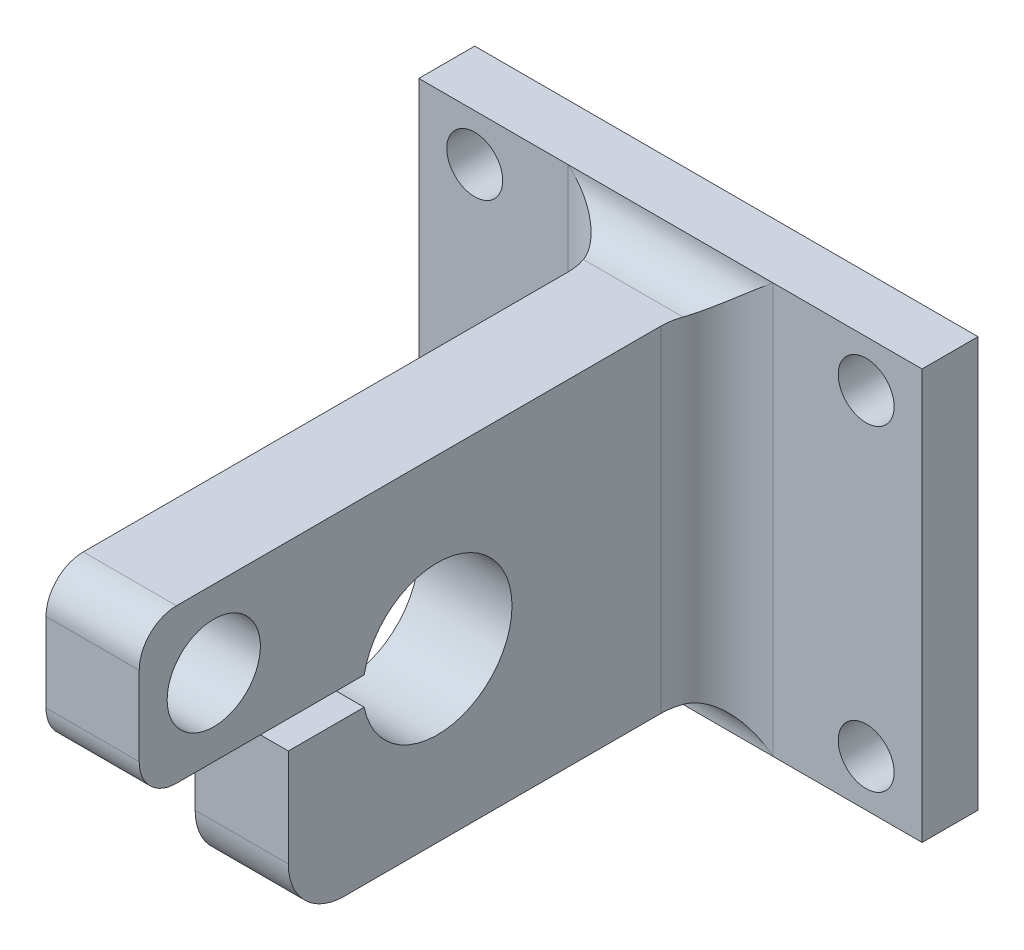
ISO-10303-21;
HEADER;
FILE_DESCRIPTION(('STEP AP214'),'2;1');
FILE_NAME('part.step','',(''),(''),'','','');
FILE_SCHEMA(('AUTOMOTIVE_DESIGN { 1 0 10303 214 1 1 1 1 }'));
ENDSEC;
DATA;
#1=APPLICATION_CONTEXT('core data for automotive mechanical design processes');
#2=APPLICATION_PROTOCOL_DEFINITION('international standard','automotive_design',2000,#1);
#3=PRODUCT_CONTEXT('',#1,'mechanical');
#4=PRODUCT('Part','Part','',(#3));
#5=PRODUCT_RELATED_PRODUCT_CATEGORY('part','',(#4));
#6=PRODUCT_DEFINITION_FORMATION('','',#4);
#7=PRODUCT_DEFINITION_CONTEXT('part definition',#1,'design');
#8=PRODUCT_DEFINITION('design','',#6,#7);
#9=PRODUCT_DEFINITION_SHAPE('','',#8);
#10=(LENGTH_UNIT() NAMED_UNIT(*) SI_UNIT(.MILLI.,.METRE.));
#11=(NAMED_UNIT(*) PLANE_ANGLE_UNIT() SI_UNIT($,.RADIAN.));
#12=(NAMED_UNIT(*) SI_UNIT($,.STERADIAN.) SOLID_ANGLE_UNIT());
#13=UNCERTAINTY_MEASURE_WITH_UNIT(LENGTH_MEASURE(1.E-05),#10,'distance_accuracy_value','');
#14=(GEOMETRIC_REPRESENTATION_CONTEXT(3) GLOBAL_UNCERTAINTY_ASSIGNED_CONTEXT((#13)) GLOBAL_UNIT_ASSIGNED_CONTEXT((#10,
#11,#12)) REPRESENTATION_CONTEXT('',''));
#15=CARTESIAN_POINT('',(0.,0.,0.));
#16=DIRECTION('',(0.,0.,1.));
#17=DIRECTION('',(1.,0.,0.));
#18=AXIS2_PLACEMENT_3D('',#15,#16,#17);
#19=CARTESIAN_POINT('',(0.,0.,3.));
#20=DIRECTION('',(0.,0.,-1.));
#21=DIRECTION('',(-1.,0.,0.));
#22=AXIS2_PLACEMENT_3D('',#19,#20,#21);
#23=PLANE('',#22);
#24=CARTESIAN_POINT('',(-10.5,8.5,3.));
#25=DIRECTION('',(0.,0.,1.));
#26=DIRECTION('',(1.,0.,0.));
#27=AXIS2_PLACEMENT_3D('',#24,#25,#26);
#28=CIRCLE('',#27,1.5);
#29=CARTESIAN_POINT('',(-9.,8.5,3.));
#30=VERTEX_POINT('',#29);
#31=EDGE_CURVE('E238',#30,#30,#28,.T.);
#32=ORIENTED_EDGE('',*,*,#31,.F.);
#33=EDGE_LOOP('',(#32));
#34=FACE_BOUND('',#33,.T.);
#35=CARTESIAN_POINT('',(-10.5,-8.5,3.));
#36=DIRECTION('',(0.,0.,1.));
#37=DIRECTION('',(1.,0.,0.));
#38=AXIS2_PLACEMENT_3D('',#35,#36,#37);
#39=CIRCLE('',#38,1.5);
#40=CARTESIAN_POINT('',(-9.,-8.5,3.));
#41=VERTEX_POINT('',#40);
#42=EDGE_CURVE('E226',#41,#41,#39,.T.);
#43=ORIENTED_EDGE('',*,*,#42,.F.);
#44=EDGE_LOOP('',(#43));
#45=FACE_BOUND('',#44,.T.);
#46=DIRECTION('',(0.,-1.,0.));
#47=VECTOR('',#46,1.);
#48=CARTESIAN_POINT('',(-5.5,9.,3.));
#49=LINE('',#48,#47);
#50=CARTESIAN_POINT('',(-5.5,-11.,3.));
#51=VERTEX_POINT('',#50);
#52=CARTESIAN_POINT('',(-5.5,11.,3.));
#53=VERTEX_POINT('',#52);
#54=EDGE_CURVE('E284',#51,#53,#49,.F.);
#55=ORIENTED_EDGE('',*,*,#54,.T.);
#56=DIRECTION('',(-1.,0.,0.));
#57=VECTOR('',#56,1.);
#58=CARTESIAN_POINT('',(-13.5,11.,3.));
#59=LINE('',#58,#57);
#60=CARTESIAN_POINT('',(-13.5,11.,3.));
#61=VERTEX_POINT('',#60);
#62=EDGE_CURVE('E247',#53,#61,#59,.T.);
#63=ORIENTED_EDGE('',*,*,#62,.T.);
#64=DIRECTION('',(0.,-1.,0.));
#65=VECTOR('',#64,1.);
#66=CARTESIAN_POINT('',(-13.5,-11.,3.));
#67=LINE('',#66,#65);
#68=CARTESIAN_POINT('',(-13.5,-11.,3.));
#69=VERTEX_POINT('',#68);
#70=EDGE_CURVE('E252',#61,#69,#67,.T.);
#71=ORIENTED_EDGE('',*,*,#70,.T.);
#72=DIRECTION('',(1.,0.,0.));
#73=VECTOR('',#72,1.);
#74=CARTESIAN_POINT('',(-13.5,-11.,3.));
#75=LINE('',#74,#73);
#76=EDGE_CURVE('E256',#69,#51,#75,.T.);
#77=ORIENTED_EDGE('',*,*,#76,.T.);
#78=EDGE_LOOP('',(#55,#63,#71,#77));
#79=FACE_BOUND('',#78,.T.);
#80=ADVANCED_FACE('F41',(#34,#45,#79),#23,.F.);
#81=CARTESIAN_POINT('',(10.5,-8.5,3.));
#82=DIRECTION('',(0.,0.,1.));
#83=DIRECTION('',(1.,0.,0.));
#84=AXIS2_PLACEMENT_3D('',#81,#82,#83);
#85=CIRCLE('',#84,1.5);
#86=CARTESIAN_POINT('',(12.,-8.5,3.));
#87=VERTEX_POINT('',#86);
#88=EDGE_CURVE('E220',#87,#87,#85,.T.);
#89=ORIENTED_EDGE('',*,*,#88,.F.);
#90=EDGE_LOOP('',(#89));
#91=FACE_BOUND('',#90,.T.);
#92=CARTESIAN_POINT('',(10.5,8.5,3.));
#93=DIRECTION('',(0.,0.,1.));
#94=DIRECTION('',(1.,0.,0.));
#95=AXIS2_PLACEMENT_3D('',#92,#93,#94);
#96=CIRCLE('',#95,1.5);
#97=CARTESIAN_POINT('',(12.,8.5,3.));
#98=VERTEX_POINT('',#97);
#99=EDGE_CURVE('E232',#98,#98,#96,.T.);
#100=ORIENTED_EDGE('',*,*,#99,.F.);
#101=EDGE_LOOP('',(#100));
#102=FACE_BOUND('',#101,.T.);
#103=CARTESIAN_POINT('',(13.5,11.,3.));
#104=VERTEX_POINT('',#103);
#105=CARTESIAN_POINT('',(5.5,11.,3.));
#106=VERTEX_POINT('',#105);
#107=EDGE_CURVE('E249',#104,#106,#59,.T.);
#108=ORIENTED_EDGE('',*,*,#107,.T.);
#109=DIRECTION('',(0.,1.,0.));
#110=VECTOR('',#109,1.);
#111=CARTESIAN_POINT('',(5.5,-9.,3.));
#112=LINE('',#111,#110);
#113=CARTESIAN_POINT('',(5.5,-11.,3.));
#114=VERTEX_POINT('',#113);
#115=EDGE_CURVE('E282',#106,#114,#112,.F.);
#116=ORIENTED_EDGE('',*,*,#115,.T.);
#117=CARTESIAN_POINT('',(13.5,-11.,3.));
#118=VERTEX_POINT('',#117);
#119=EDGE_CURVE('E255',#114,#118,#75,.T.);
#120=ORIENTED_EDGE('',*,*,#119,.T.);
#121=DIRECTION('',(0.,1.,0.));
#122=VECTOR('',#121,1.);
#123=CARTESIAN_POINT('',(13.5,-11.,3.));
#124=LINE('',#123,#122);
#125=EDGE_CURVE('E244',#118,#104,#124,.T.);
#126=ORIENTED_EDGE('',*,*,#125,.T.);
#127=EDGE_LOOP('',(#108,#116,#120,#126));
#128=FACE_BOUND('',#127,.T.);
#129=ADVANCED_FACE('F443',(#91,#102,#128),#23,.F.);
#130=CARTESIAN_POINT('',(0.,0.,0.));
#131=DIRECTION('',(0.,0.,-1.));
#132=DIRECTION('',(-1.,0.,0.));
#133=AXIS2_PLACEMENT_3D('',#130,#131,#132);
#134=PLANE('',#133);
#135=CARTESIAN_POINT('',(-10.5,-8.5,0.));
#136=DIRECTION('',(0.,0.,1.));
#137=DIRECTION('',(1.,0.,0.));
#138=AXIS2_PLACEMENT_3D('',#135,#136,#137);
#139=CIRCLE('',#138,1.5);
#140=CARTESIAN_POINT('',(-9.,-8.5,0.));
#141=VERTEX_POINT('',#140);
#142=EDGE_CURVE('E223',#141,#141,#139,.T.);
#143=ORIENTED_EDGE('',*,*,#142,.T.);
#144=EDGE_LOOP('',(#143));
#145=FACE_BOUND('',#144,.T.);
#146=CARTESIAN_POINT('',(-10.5,8.5,0.));
#147=DIRECTION('',(0.,0.,1.));
#148=DIRECTION('',(1.,0.,0.));
#149=AXIS2_PLACEMENT_3D('',#146,#147,#148);
#150=CIRCLE('',#149,1.5);
#151=CARTESIAN_POINT('',(-9.,8.5,0.));
#152=VERTEX_POINT('',#151);
#153=EDGE_CURVE('E235',#152,#152,#150,.T.);
#154=ORIENTED_EDGE('',*,*,#153,.T.);
#155=EDGE_LOOP('',(#154));
#156=FACE_BOUND('',#155,.T.);
#157=DIRECTION('',(0.,1.,0.));
#158=VECTOR('',#157,1.);
#159=CARTESIAN_POINT('',(13.5,-11.,0.));
#160=LINE('',#159,#158);
#161=CARTESIAN_POINT('',(13.5,-11.,0.));
#162=VERTEX_POINT('',#161);
#163=CARTESIAN_POINT('',(13.5,11.,0.));
#164=VERTEX_POINT('',#163);
#165=EDGE_CURVE('E241',#162,#164,#160,.T.);
#166=ORIENTED_EDGE('',*,*,#165,.F.);
#167=DIRECTION('',(1.,0.,0.));
#168=VECTOR('',#167,1.);
#169=CARTESIAN_POINT('',(-13.5,-11.,0.));
#170=LINE('',#169,#168);
#171=CARTESIAN_POINT('',(-13.5,-11.,0.));
#172=VERTEX_POINT('',#171);
#173=EDGE_CURVE('E248',#172,#162,#170,.T.);
#174=ORIENTED_EDGE('',*,*,#173,.F.);
#175=DIRECTION('',(0.,-1.,0.));
#176=VECTOR('',#175,1.);
#177=CARTESIAN_POINT('',(-13.5,-11.,0.));
#178=LINE('',#177,#176);
#179=CARTESIAN_POINT('',(-13.5,11.,0.));
#180=VERTEX_POINT('',#179);
#181=EDGE_CURVE('E265',#180,#172,#178,.T.);
#182=ORIENTED_EDGE('',*,*,#181,.F.);
#183=DIRECTION('',(-1.,0.,0.));
#184=VECTOR('',#183,1.);
#185=CARTESIAN_POINT('',(-13.5,11.,0.));
#186=LINE('',#185,#184);
#187=EDGE_CURVE('E263',#164,#180,#186,.T.);
#188=ORIENTED_EDGE('',*,*,#187,.F.);
#189=EDGE_LOOP('',(#166,#174,#182,#188));
#190=FACE_BOUND('',#189,.T.);
#191=CARTESIAN_POINT('',(10.5,8.5,0.));
#192=DIRECTION('',(0.,0.,1.));
#193=DIRECTION('',(1.,0.,0.));
#194=AXIS2_PLACEMENT_3D('',#191,#192,#193);
#195=CIRCLE('',#194,1.5);
#196=CARTESIAN_POINT('',(12.,8.5,0.));
#197=VERTEX_POINT('',#196);
#198=EDGE_CURVE('E229',#197,#197,#195,.T.);
#199=ORIENTED_EDGE('',*,*,#198,.T.);
#200=EDGE_LOOP('',(#199));
#201=FACE_BOUND('',#200,.T.);
#202=CARTESIAN_POINT('',(10.5,-8.5,0.));
#203=DIRECTION('',(0.,0.,1.));
#204=DIRECTION('',(1.,0.,0.));
#205=AXIS2_PLACEMENT_3D('',#202,#203,#204);
#206=CIRCLE('',#205,1.5);
#207=CARTESIAN_POINT('',(12.,-8.5,0.));
#208=VERTEX_POINT('',#207);
#209=EDGE_CURVE('E219',#208,#208,#206,.T.);
#210=ORIENTED_EDGE('',*,*,#209,.T.);
#211=EDGE_LOOP('',(#210));
#212=FACE_BOUND('',#211,.T.);
#213=ADVANCED_FACE('F453',(#145,#156,#190,#201,#212),#134,.T.);
#214=CARTESIAN_POINT('',(13.5,-11.,3.));
#215=DIRECTION('',(-1.,0.,0.));
#216=DIRECTION('',(0.,0.,1.));
#217=AXIS2_PLACEMENT_3D('',#214,#215,#216);
#218=PLANE('',#217);
#219=ORIENTED_EDGE('',*,*,#165,.T.);
#220=DIRECTION('',(0.,0.,-1.));
#221=VECTOR('',#220,1.);
#222=CARTESIAN_POINT('',(13.5,11.,3.));
#223=LINE('',#222,#221);
#224=EDGE_CURVE('E185',#104,#164,#223,.T.);
#225=ORIENTED_EDGE('',*,*,#224,.F.);
#226=ORIENTED_EDGE('',*,*,#125,.F.);
#227=DIRECTION('',(0.,0.,-1.));
#228=VECTOR('',#227,1.);
#229=CARTESIAN_POINT('',(13.5,-11.,3.));
#230=LINE('',#229,#228);
#231=EDGE_CURVE('E259',#118,#162,#230,.T.);
#232=ORIENTED_EDGE('',*,*,#231,.T.);
#233=EDGE_LOOP('',(#219,#225,#226,#232));
#234=FACE_BOUND('',#233,.T.);
#235=ADVANCED_FACE('F448',(#234),#218,.F.);
#236=CARTESIAN_POINT('',(-13.5,11.,3.));
#237=DIRECTION('',(0.,-1.,0.));
#238=DIRECTION('',(0.,0.,-1.));
#239=AXIS2_PLACEMENT_3D('',#236,#237,#238);
#240=PLANE('',#239);
#241=ORIENTED_EDGE('',*,*,#187,.T.);
#242=DIRECTION('',(0.,0.,-1.));
#243=VECTOR('',#242,1.);
#244=CARTESIAN_POINT('',(-13.5,11.,3.));
#245=LINE('',#244,#243);
#246=EDGE_CURVE('E273',#61,#180,#245,.T.);
#247=ORIENTED_EDGE('',*,*,#246,.F.);
#248=ORIENTED_EDGE('',*,*,#62,.F.);
#249=EDGE_CURVE('E253',#106,#53,#59,.T.);
#250=ORIENTED_EDGE('',*,*,#249,.F.);
#251=ORIENTED_EDGE('',*,*,#107,.F.);
#252=ORIENTED_EDGE('',*,*,#224,.T.);
#253=EDGE_LOOP('',(#241,#247,#248,#250,#251,#252));
#254=FACE_BOUND('',#253,.T.);
#255=ADVANCED_FACE('F433',(#254),#240,.F.);
#256=CARTESIAN_POINT('',(-13.5,-11.,3.));
#257=DIRECTION('',(1.,0.,0.));
#258=DIRECTION('',(0.,0.,-1.));
#259=AXIS2_PLACEMENT_3D('',#256,#257,#258);
#260=PLANE('',#259);
#261=ORIENTED_EDGE('',*,*,#181,.T.);
#262=DIRECTION('',(0.,0.,-1.));
#263=VECTOR('',#262,1.);
#264=CARTESIAN_POINT('',(-13.5,-11.,3.));
#265=LINE('',#264,#263);
#266=EDGE_CURVE('E270',#69,#172,#265,.T.);
#267=ORIENTED_EDGE('',*,*,#266,.F.);
#268=ORIENTED_EDGE('',*,*,#70,.F.);
#269=ORIENTED_EDGE('',*,*,#246,.T.);
#270=EDGE_LOOP('',(#261,#267,#268,#269));
#271=FACE_BOUND('',#270,.T.);
#272=ADVANCED_FACE('F452',(#271),#260,.F.);
#273=CARTESIAN_POINT('',(-13.5,-11.,3.));
#274=DIRECTION('',(0.,1.,0.));
#275=DIRECTION('',(0.,0.,1.));
#276=AXIS2_PLACEMENT_3D('',#273,#274,#275);
#277=PLANE('',#276);
#278=ORIENTED_EDGE('',*,*,#173,.T.);
#279=ORIENTED_EDGE('',*,*,#231,.F.);
#280=ORIENTED_EDGE('',*,*,#119,.F.);
#281=EDGE_CURVE('E260',#51,#114,#75,.T.);
#282=ORIENTED_EDGE('',*,*,#281,.F.);
#283=ORIENTED_EDGE('',*,*,#76,.F.);
#284=ORIENTED_EDGE('',*,*,#266,.T.);
#285=EDGE_LOOP('',(#278,#279,#280,#282,#283,#284));
#286=FACE_BOUND('',#285,.T.);
#287=ADVANCED_FACE('F439',(#286),#277,.F.);
#288=CARTESIAN_POINT('',(-10.5,8.5,3.));
#289=DIRECTION('',(0.,0.,-1.));
#290=DIRECTION('',(-1.,0.,0.));
#291=AXIS2_PLACEMENT_3D('',#288,#289,#290);
#292=CYLINDRICAL_SURFACE('',#291,1.5);
#293=ORIENTED_EDGE('',*,*,#31,.T.);
#294=EDGE_LOOP('',(#293));
#295=FACE_BOUND('',#294,.T.);
#296=ORIENTED_EDGE('',*,*,#153,.F.);
#297=EDGE_LOOP('',(#296));
#298=FACE_BOUND('',#297,.T.);
#299=ADVANCED_FACE('F485',(#295,#298),#292,.F.);
#300=CARTESIAN_POINT('',(10.5,8.5,3.));
#301=DIRECTION('',(0.,0.,-1.));
#302=DIRECTION('',(-1.,0.,0.));
#303=AXIS2_PLACEMENT_3D('',#300,#301,#302);
#304=CYLINDRICAL_SURFACE('',#303,1.5);
#305=ORIENTED_EDGE('',*,*,#99,.T.);
#306=EDGE_LOOP('',(#305));
#307=FACE_BOUND('',#306,.T.);
#308=ORIENTED_EDGE('',*,*,#198,.F.);
#309=EDGE_LOOP('',(#308));
#310=FACE_BOUND('',#309,.T.);
#311=ADVANCED_FACE('F472',(#307,#310),#304,.F.);
#312=CARTESIAN_POINT('',(-10.5,-8.5,3.));
#313=DIRECTION('',(0.,0.,-1.));
#314=DIRECTION('',(-1.,0.,0.));
#315=AXIS2_PLACEMENT_3D('',#312,#313,#314);
#316=CYLINDRICAL_SURFACE('',#315,1.5);
#317=ORIENTED_EDGE('',*,*,#42,.T.);
#318=EDGE_LOOP('',(#317));
#319=FACE_BOUND('',#318,.T.);
#320=ORIENTED_EDGE('',*,*,#142,.F.);
#321=EDGE_LOOP('',(#320));
#322=FACE_BOUND('',#321,.T.);
#323=ADVANCED_FACE('F464',(#319,#322),#316,.F.);
#324=CARTESIAN_POINT('',(10.5,-8.5,3.));
#325=DIRECTION('',(0.,0.,-1.));
#326=DIRECTION('',(-1.,0.,0.));
#327=AXIS2_PLACEMENT_3D('',#324,#325,#326);
#328=CYLINDRICAL_SURFACE('',#327,1.5);
#329=ORIENTED_EDGE('',*,*,#88,.T.);
#330=EDGE_LOOP('',(#329));
#331=FACE_BOUND('',#330,.T.);
#332=ORIENTED_EDGE('',*,*,#209,.F.);
#333=EDGE_LOOP('',(#332));
#334=FACE_BOUND('',#333,.T.);
#335=ADVANCED_FACE('F462',(#331,#334),#328,.F.);
#336=CARTESIAN_POINT('',(-2.5,9.,26.));
#337=DIRECTION('',(1.,0.,0.));
#338=DIRECTION('',(0.,0.,-1.));
#339=AXIS2_PLACEMENT_3D('',#336,#337,#338);
#340=PLANE('',#339);
#341=DIRECTION('',(0.,0.,1.));
#342=VECTOR('',#341,1.);
#343=CARTESIAN_POINT('',(-2.5,0.750000000000001,26.));
#344=LINE('',#343,#342);
#345=CARTESIAN_POINT('',(-2.5,0.75,21.9290584113754));
#346=VERTEX_POINT('',#345);
#347=CARTESIAN_POINT('',(-2.5,0.750000000000001,32.));
#348=VERTEX_POINT('',#347);
#349=EDGE_CURVE('E205',#346,#348,#344,.T.);
#350=ORIENTED_EDGE('',*,*,#349,.T.);
#351=CARTESIAN_POINT('',(-2.5,2.75,32.));
#352=DIRECTION('',(1.,0.,0.));
#353=DIRECTION('',(0.,0.,-1.));
#354=AXIS2_PLACEMENT_3D('',#351,#352,#353);
#355=CIRCLE('',#354,2.);
#356=CARTESIAN_POINT('',(-2.5,2.75,34.));
#357=VERTEX_POINT('',#356);
#358=EDGE_CURVE('E367',#348,#357,#355,.F.);
#359=ORIENTED_EDGE('',*,*,#358,.T.);
#360=DIRECTION('',(0.,1.,0.));
#361=VECTOR('',#360,1.);
#362=CARTESIAN_POINT('',(-2.5,9.,34.));
#363=LINE('',#362,#361);
#364=CARTESIAN_POINT('',(-2.5,7.,34.));
#365=VERTEX_POINT('',#364);
#366=EDGE_CURVE('E387',#357,#365,#363,.T.);
#367=ORIENTED_EDGE('',*,*,#366,.T.);
#368=CARTESIAN_POINT('',(-2.5,7.,32.));
#369=DIRECTION('',(1.,0.,0.));
#370=DIRECTION('',(0.,0.,-1.));
#371=AXIS2_PLACEMENT_3D('',#368,#369,#370);
#372=CIRCLE('',#371,2.);
#373=CARTESIAN_POINT('',(-2.5,9.,32.));
#374=VERTEX_POINT('',#373);
#375=EDGE_CURVE('E365',#365,#374,#372,.F.);
#376=ORIENTED_EDGE('',*,*,#375,.T.);
#377=DIRECTION('',(0.,0.,-1.));
#378=VECTOR('',#377,1.);
#379=CARTESIAN_POINT('',(-2.5,9.,26.));
#380=LINE('',#379,#378);
#381=CARTESIAN_POINT('',(-2.5,9.,6.));
#382=VERTEX_POINT('',#381);
#383=EDGE_CURVE('E211',#374,#382,#380,.T.);
#384=ORIENTED_EDGE('',*,*,#383,.T.);
#385=DIRECTION('',(0.,-1.,0.));
#386=VECTOR('',#385,1.);
#387=CARTESIAN_POINT('',(-2.5,-9.,6.));
#388=LINE('',#387,#386);
#389=CARTESIAN_POINT('',(-2.5,-9.,6.));
#390=VERTEX_POINT('',#389);
#391=EDGE_CURVE('E279',#382,#390,#388,.T.);
#392=ORIENTED_EDGE('',*,*,#391,.T.);
#393=DIRECTION('',(0.,0.,-1.));
#394=VECTOR('',#393,1.);
#395=CARTESIAN_POINT('',(-2.5,-9.,26.));
#396=LINE('',#395,#394);
#397=CARTESIAN_POINT('',(-2.5,-9.,23.));
#398=VERTEX_POINT('',#397);
#399=EDGE_CURVE('E217',#398,#390,#396,.T.);
#400=ORIENTED_EDGE('',*,*,#399,.F.);
#401=CARTESIAN_POINT('',(-2.5,-6.,23.));
#402=DIRECTION('',(1.,0.,0.));
#403=DIRECTION('',(0.,0.,-1.));
#404=AXIS2_PLACEMENT_3D('',#401,#402,#403);
#405=CIRCLE('',#404,3.);
#406=CARTESIAN_POINT('',(-2.5,-6.,26.));
#407=VERTEX_POINT('',#406);
#408=EDGE_CURVE('E360',#398,#407,#405,.F.);
#409=ORIENTED_EDGE('',*,*,#408,.T.);
#410=DIRECTION('',(0.,-1.,0.));
#411=VECTOR('',#410,1.);
#412=CARTESIAN_POINT('',(-2.5,9.,26.));
#413=LINE('',#412,#411);
#414=CARTESIAN_POINT('',(-2.5,-0.749999999999999,26.));
#415=VERTEX_POINT('',#414);
#416=EDGE_CURVE('E195',#415,#407,#413,.T.);
#417=ORIENTED_EDGE('',*,*,#416,.F.);
#418=DIRECTION('',(0.,0.,-1.));
#419=VECTOR('',#418,1.);
#420=CARTESIAN_POINT('',(-2.5,-0.749999999999999,26.));
#421=LINE('',#420,#419);
#422=CARTESIAN_POINT('',(-2.5,-0.75,21.9290584113754));
#423=VERTEX_POINT('',#422);
#424=EDGE_CURVE('E176',#415,#423,#421,.T.);
#425=ORIENTED_EDGE('',*,*,#424,.T.);
#426=CARTESIAN_POINT('',(-2.5,0.,18.));
#427=DIRECTION('',(1.,0.,0.));
#428=DIRECTION('',(0.,0.,-1.));
#429=AXIS2_PLACEMENT_3D('',#426,#427,#428);
#430=CIRCLE('',#429,4.);
#431=EDGE_CURVE('E193',#423,#346,#430,.T.);
#432=ORIENTED_EDGE('',*,*,#431,.T.);
#433=EDGE_LOOP('',(#350,#359,#367,#376,#384,#392,#400,#409,#417,#425,#432));
#434=FACE_BOUND('',#433,.T.);
#435=CARTESIAN_POINT('',(-2.5,4.875,30.));
#436=DIRECTION('',(-1.,0.,0.));
#437=DIRECTION('',(0.,0.,1.));
#438=AXIS2_PLACEMENT_3D('',#435,#436,#437);
#439=CIRCLE('',#438,2.5);
#440=CARTESIAN_POINT('',(-2.5,4.875,32.5));
#441=VERTEX_POINT('',#440);
#442=EDGE_CURVE('E390',#441,#441,#439,.T.);
#443=ORIENTED_EDGE('',*,*,#442,.F.);
#444=EDGE_LOOP('',(#443));
#445=FACE_BOUND('',#444,.T.);
#446=ADVANCED_FACE('F191',(#434,#445),#340,.F.);
#447=CARTESIAN_POINT('',(-2.5,-9.,26.));
#448=DIRECTION('',(0.,1.,0.));
#449=DIRECTION('',(0.,0.,1.));
#450=AXIS2_PLACEMENT_3D('',#447,#448,#449);
#451=PLANE('',#450);
#452=DIRECTION('',(0.,0.,-1.));
#453=VECTOR('',#452,1.);
#454=CARTESIAN_POINT('',(2.5,-9.,26.));
#455=LINE('',#454,#453);
#456=CARTESIAN_POINT('',(2.5,-9.,23.));
#457=VERTEX_POINT('',#456);
#458=CARTESIAN_POINT('',(2.5,-9.,6.));
#459=VERTEX_POINT('',#458);
#460=EDGE_CURVE('E215',#457,#459,#455,.T.);
#461=ORIENTED_EDGE('',*,*,#460,.F.);
#462=DIRECTION('',(1.,0.,0.));
#463=VECTOR('',#462,1.);
#464=CARTESIAN_POINT('',(-2.5,-9.,23.));
#465=LINE('',#464,#463);
#466=EDGE_CURVE('E358',#457,#398,#465,.F.);
#467=ORIENTED_EDGE('',*,*,#466,.T.);
#468=ORIENTED_EDGE('',*,*,#399,.T.);
#469=CARTESIAN_POINT('',(-5.5,-9.,6.));
#470=DIRECTION('',(0.,1.,0.));
#471=DIRECTION('',(0.,0.,1.));
#472=AXIS2_PLACEMENT_3D('',#469,#470,#471);
#473=CIRCLE('',#472,3.);
#474=CARTESIAN_POINT('',(-2.67157287525381,-9.,5.));
#475=VERTEX_POINT('',#474);
#476=EDGE_CURVE('E289',#390,#475,#473,.T.);
#477=ORIENTED_EDGE('',*,*,#476,.T.);
#478=DIRECTION('',(1.,0.,0.));
#479=VECTOR('',#478,1.);
#480=CARTESIAN_POINT('',(5.5,-9.,5.));
#481=LINE('',#480,#479);
#482=CARTESIAN_POINT('',(2.67157287525381,-9.,5.));
#483=VERTEX_POINT('',#482);
#484=EDGE_CURVE('E304',#475,#483,#481,.T.);
#485=ORIENTED_EDGE('',*,*,#484,.T.);
#486=CARTESIAN_POINT('',(5.5,-9.,6.));
#487=DIRECTION('',(0.,1.,0.));
#488=DIRECTION('',(0.,0.,1.));
#489=AXIS2_PLACEMENT_3D('',#486,#487,#488);
#490=CIRCLE('',#489,3.);
#491=EDGE_CURVE('E298',#483,#459,#490,.T.);
#492=ORIENTED_EDGE('',*,*,#491,.T.);
#493=EDGE_LOOP('',(#461,#467,#468,#477,#485,#492));
#494=FACE_BOUND('',#493,.T.);
#495=ADVANCED_FACE('F410',(#494),#451,.F.);
#496=CARTESIAN_POINT('',(2.5,9.,26.));
#497=DIRECTION('',(-1.,0.,0.));
#498=DIRECTION('',(0.,0.,1.));
#499=AXIS2_PLACEMENT_3D('',#496,#497,#498);
#500=PLANE('',#499);
#501=DIRECTION('',(0.,-1.,0.));
#502=VECTOR('',#501,1.);
#503=CARTESIAN_POINT('',(2.5,9.,34.));
#504=LINE('',#503,#502);
#505=CARTESIAN_POINT('',(2.5,7.,34.));
#506=VERTEX_POINT('',#505);
#507=CARTESIAN_POINT('',(2.5,2.75,34.));
#508=VERTEX_POINT('',#507);
#509=EDGE_CURVE('E380',#506,#508,#504,.T.);
#510=ORIENTED_EDGE('',*,*,#509,.T.);
#511=CARTESIAN_POINT('',(2.5,2.75,32.));
#512=DIRECTION('',(-1.,0.,0.));
#513=DIRECTION('',(0.,0.,1.));
#514=AXIS2_PLACEMENT_3D('',#511,#512,#513);
#515=CIRCLE('',#514,2.);
#516=CARTESIAN_POINT('',(2.5,0.750000000000001,32.));
#517=VERTEX_POINT('',#516);
#518=EDGE_CURVE('E49',#508,#517,#515,.F.);
#519=ORIENTED_EDGE('',*,*,#518,.T.);
#520=DIRECTION('',(0.,0.,-1.));
#521=VECTOR('',#520,1.);
#522=CARTESIAN_POINT('',(2.5,0.750000000000001,26.));
#523=LINE('',#522,#521);
#524=CARTESIAN_POINT('',(2.5,0.75,21.9290584113754));
#525=VERTEX_POINT('',#524);
#526=EDGE_CURVE('E379',#517,#525,#523,.T.);
#527=ORIENTED_EDGE('',*,*,#526,.T.);
#528=CARTESIAN_POINT('',(2.5,0.,18.));
#529=DIRECTION('',(-1.,0.,0.));
#530=DIRECTION('',(0.,0.,1.));
#531=AXIS2_PLACEMENT_3D('',#528,#529,#530);
#532=CIRCLE('',#531,4.);
#533=CARTESIAN_POINT('',(2.5,-0.75,21.9290584113754));
#534=VERTEX_POINT('',#533);
#535=EDGE_CURVE('E201',#525,#534,#532,.T.);
#536=ORIENTED_EDGE('',*,*,#535,.T.);
#537=DIRECTION('',(0.,0.,1.));
#538=VECTOR('',#537,1.);
#539=CARTESIAN_POINT('',(2.5,-0.749999999999999,26.));
#540=LINE('',#539,#538);
#541=CARTESIAN_POINT('',(2.5,-0.749999999999999,26.));
#542=VERTEX_POINT('',#541);
#543=EDGE_CURVE('E179',#534,#542,#540,.T.);
#544=ORIENTED_EDGE('',*,*,#543,.T.);
#545=DIRECTION('',(0.,1.,0.));
#546=VECTOR('',#545,1.);
#547=CARTESIAN_POINT('',(2.5,9.,26.));
#548=LINE('',#547,#546);
#549=CARTESIAN_POINT('',(2.5,-6.,26.));
#550=VERTEX_POINT('',#549);
#551=EDGE_CURVE('E203',#550,#542,#548,.T.);
#552=ORIENTED_EDGE('',*,*,#551,.F.);
#553=CARTESIAN_POINT('',(2.5,-6.,23.));
#554=DIRECTION('',(-1.,0.,0.));
#555=DIRECTION('',(0.,0.,1.));
#556=AXIS2_PLACEMENT_3D('',#553,#554,#555);
#557=CIRCLE('',#556,3.);
#558=EDGE_CURVE('E356',#550,#457,#557,.F.);
#559=ORIENTED_EDGE('',*,*,#558,.T.);
#560=ORIENTED_EDGE('',*,*,#460,.T.);
#561=DIRECTION('',(0.,1.,0.));
#562=VECTOR('',#561,1.);
#563=CARTESIAN_POINT('',(2.5,9.,6.));
#564=LINE('',#563,#562);
#565=CARTESIAN_POINT('',(2.5,9.,6.));
#566=VERTEX_POINT('',#565);
#567=EDGE_CURVE('E286',#459,#566,#564,.T.);
#568=ORIENTED_EDGE('',*,*,#567,.T.);
#569=DIRECTION('',(0.,0.,-1.));
#570=VECTOR('',#569,1.);
#571=CARTESIAN_POINT('',(2.5,9.,26.));
#572=LINE('',#571,#570);
#573=CARTESIAN_POINT('',(2.5,9.,32.));
#574=VERTEX_POINT('',#573);
#575=EDGE_CURVE('E213',#574,#566,#572,.T.);
#576=ORIENTED_EDGE('',*,*,#575,.F.);
#577=CARTESIAN_POINT('',(2.5,7.,32.));
#578=DIRECTION('',(-1.,0.,0.));
#579=DIRECTION('',(0.,0.,1.));
#580=AXIS2_PLACEMENT_3D('',#577,#578,#579);
#581=CIRCLE('',#580,2.);
#582=EDGE_CURVE('E373',#574,#506,#581,.F.);
#583=ORIENTED_EDGE('',*,*,#582,.T.);
#584=EDGE_LOOP('',(#510,#519,#527,#536,#544,#552,#559,#560,#568,#576,#583));
#585=FACE_BOUND('',#584,.T.);
#586=CARTESIAN_POINT('',(2.5,4.875,30.));
#587=DIRECTION('',(-1.,0.,0.));
#588=DIRECTION('',(0.,0.,1.));
#589=AXIS2_PLACEMENT_3D('',#586,#587,#588);
#590=CIRCLE('',#589,2.5);
#591=CARTESIAN_POINT('',(2.5,4.875,32.5));
#592=VERTEX_POINT('',#591);
#593=EDGE_CURVE('E392',#592,#592,#590,.F.);
#594=ORIENTED_EDGE('',*,*,#593,.F.);
#595=EDGE_LOOP('',(#594));
#596=FACE_BOUND('',#595,.T.);
#597=ADVANCED_FACE('F377',(#585,#596),#500,.F.);
#598=CARTESIAN_POINT('',(-2.5,9.,26.));
#599=DIRECTION('',(0.,-1.,0.));
#600=DIRECTION('',(0.,0.,-1.));
#601=AXIS2_PLACEMENT_3D('',#598,#599,#600);
#602=PLANE('',#601);
#603=ORIENTED_EDGE('',*,*,#383,.F.);
#604=DIRECTION('',(-1.,0.,0.));
#605=VECTOR('',#604,1.);
#606=CARTESIAN_POINT('',(2.5,9.,32.));
#607=LINE('',#606,#605);
#608=EDGE_CURVE('E11',#374,#574,#607,.F.);
#609=ORIENTED_EDGE('',*,*,#608,.T.);
#610=ORIENTED_EDGE('',*,*,#575,.T.);
#611=CARTESIAN_POINT('',(5.5,9.,6.));
#612=DIRECTION('',(0.,-1.,0.));
#613=DIRECTION('',(0.,0.,-1.));
#614=AXIS2_PLACEMENT_3D('',#611,#612,#613);
#615=CIRCLE('',#614,3.);
#616=CARTESIAN_POINT('',(2.67157287525381,9.,5.));
#617=VERTEX_POINT('',#616);
#618=EDGE_CURVE('E295',#566,#617,#615,.T.);
#619=ORIENTED_EDGE('',*,*,#618,.T.);
#620=DIRECTION('',(-1.,0.,0.));
#621=VECTOR('',#620,1.);
#622=CARTESIAN_POINT('',(-5.5,9.,5.));
#623=LINE('',#622,#621);
#624=CARTESIAN_POINT('',(-2.67157287525381,9.,5.));
#625=VERTEX_POINT('',#624);
#626=EDGE_CURVE('E301',#617,#625,#623,.T.);
#627=ORIENTED_EDGE('',*,*,#626,.T.);
#628=CARTESIAN_POINT('',(-5.5,9.,6.));
#629=DIRECTION('',(0.,-1.,0.));
#630=DIRECTION('',(0.,0.,-1.));
#631=AXIS2_PLACEMENT_3D('',#628,#629,#630);
#632=CIRCLE('',#631,3.);
#633=EDGE_CURVE('E292',#625,#382,#632,.T.);
#634=ORIENTED_EDGE('',*,*,#633,.T.);
#635=EDGE_LOOP('',(#603,#609,#610,#619,#627,#634));
#636=FACE_BOUND('',#635,.T.);
#637=ADVANCED_FACE('F429',(#636),#602,.F.);
#638=CARTESIAN_POINT('',(0.,0.,26.));
#639=DIRECTION('',(0.,0.,1.));
#640=DIRECTION('',(1.,0.,0.));
#641=AXIS2_PLACEMENT_3D('',#638,#639,#640);
#642=PLANE('',#641);
#643=ORIENTED_EDGE('',*,*,#416,.T.);
#644=DIRECTION('',(1.,0.,0.));
#645=VECTOR('',#644,1.);
#646=CARTESIAN_POINT('',(2.5,-6.,26.));
#647=LINE('',#646,#645);
#648=EDGE_CURVE('E353',#407,#550,#647,.T.);
#649=ORIENTED_EDGE('',*,*,#648,.T.);
#650=ORIENTED_EDGE('',*,*,#551,.T.);
#651=DIRECTION('',(1.,0.,0.));
#652=VECTOR('',#651,1.);
#653=CARTESIAN_POINT('',(0.,-0.75,26.));
#654=LINE('',#653,#652);
#655=EDGE_CURVE('E196',#415,#542,#654,.T.);
#656=ORIENTED_EDGE('',*,*,#655,.F.);
#657=EDGE_LOOP('',(#643,#649,#650,#656));
#658=FACE_BOUND('',#657,.T.);
#659=ADVANCED_FACE('F403',(#658),#642,.T.);
#660=CARTESIAN_POINT('',(-13.5,0.,18.));
#661=DIRECTION('',(1.,0.,0.));
#662=DIRECTION('',(0.,1.,0.));
#663=AXIS2_PLACEMENT_3D('',#660,#661,#662);
#664=CYLINDRICAL_SURFACE('',#663,4.);
#665=ORIENTED_EDGE('',*,*,#535,.F.);
#666=DIRECTION('',(1.,0.,0.));
#667=VECTOR('',#666,1.);
#668=CARTESIAN_POINT('',(-13.5,0.749999999999999,21.9290584113754));
#669=LINE('',#668,#667);
#670=EDGE_CURVE('E184',#525,#346,#669,.F.);
#671=ORIENTED_EDGE('',*,*,#670,.T.);
#672=ORIENTED_EDGE('',*,*,#431,.F.);
#673=DIRECTION('',(1.,0.,0.));
#674=VECTOR('',#673,1.);
#675=CARTESIAN_POINT('',(-13.5,-0.750000000000001,21.9290584113754));
#676=LINE('',#675,#674);
#677=EDGE_CURVE('E172',#423,#534,#676,.T.);
#678=ORIENTED_EDGE('',*,*,#677,.T.);
#679=EDGE_LOOP('',(#665,#671,#672,#678));
#680=FACE_BOUND('',#679,.T.);
#681=ADVANCED_FACE('F199',(#680),#664,.F.);
#682=CARTESIAN_POINT('',(-13.5,-0.750000000000001,26.248621229044));
#683=DIRECTION('',(0.,-1.,0.));
#684=DIRECTION('',(1.,0.,0.));
#685=AXIS2_PLACEMENT_3D('',#682,#683,#684);
#686=PLANE('',#685);
#687=ORIENTED_EDGE('',*,*,#655,.T.);
#688=ORIENTED_EDGE('',*,*,#543,.F.);
#689=ORIENTED_EDGE('',*,*,#677,.F.);
#690=ORIENTED_EDGE('',*,*,#424,.F.);
#691=EDGE_LOOP('',(#687,#688,#689,#690));
#692=FACE_BOUND('',#691,.T.);
#693=ADVANCED_FACE('F175',(#692),#686,.F.);
#694=CARTESIAN_POINT('',(-13.5,0.749999999999999,26.248621229044));
#695=DIRECTION('',(0.,1.,0.));
#696=DIRECTION('',(-1.,0.,0.));
#697=AXIS2_PLACEMENT_3D('',#694,#695,#696);
#698=PLANE('',#697);
#699=ORIENTED_EDGE('',*,*,#526,.F.);
#700=DIRECTION('',(-1.,0.,0.));
#701=VECTOR('',#700,1.);
#702=CARTESIAN_POINT('',(-2.5,0.75,32.));
#703=LINE('',#702,#701);
#704=EDGE_CURVE('E362',#517,#348,#703,.T.);
#705=ORIENTED_EDGE('',*,*,#704,.T.);
#706=ORIENTED_EDGE('',*,*,#349,.F.);
#707=ORIENTED_EDGE('',*,*,#670,.F.);
#708=EDGE_LOOP('',(#699,#705,#706,#707));
#709=FACE_BOUND('',#708,.T.);
#710=ADVANCED_FACE('F384',(#709),#698,.F.);
#711=CARTESIAN_POINT('',(-5.5,9.,6.));
#712=DIRECTION('',(0.,1.,0.));
#713=DIRECTION('',(0.,0.,1.));
#714=AXIS2_PLACEMENT_3D('',#711,#712,#713);
#715=CYLINDRICAL_SURFACE('',#714,3.);
#716=ORIENTED_EDGE('',*,*,#633,.F.);
#717=CARTESIAN_POINT('',(-2.67157287525381,9.,5.));
#718=CARTESIAN_POINT('',(-2.69149294973119,8.99999155503509,4.94361594444744));
#719=CARTESIAN_POINT('',(-2.71311302695195,9.00238347095707,4.88786909475856));
#720=CARTESIAN_POINT('',(-2.7594527877804,9.01158389686028,4.77814902785896));
#721=CARTESIAN_POINT('',(-2.78416767868531,9.01838564428017,4.72417322764302));
#722=CARTESIAN_POINT('',(-2.83619567545749,9.03593499103551,4.61885296789473));
#723=CARTESIAN_POINT('',(-2.86348007762533,9.04664212178408,4.56748746748839));
#724=CARTESIAN_POINT('',(-2.92057008119132,9.07161665691399,4.46706699101029));
#725=CARTESIAN_POINT('',(-2.950376866033,9.08588573867057,4.41801311649193));
#726=CARTESIAN_POINT('',(-3.05723520480667,9.14067309364308,4.25289315377526));
#727=CARTESIAN_POINT('',(-3.13999069126978,9.18920087639875,4.14304885768411));
#728=CARTESIAN_POINT('',(-3.31552818334488,9.30042012910899,3.93933803827304));
#729=CARTESIAN_POINT('',(-3.40835361356281,9.36317432497027,3.84554560467289));
#730=CARTESIAN_POINT('',(-3.63830760334613,9.52506668300537,3.64074279636961));
#731=CARTESIAN_POINT('',(-3.7786858419373,9.62888978797455,3.53710272129047));
#732=CARTESIAN_POINT('',(-4.06777829054136,9.84870842794342,3.35846668206518));
#733=CARTESIAN_POINT('',(-4.21650387636293,9.96472077181732,3.2835109521063));
#734=CARTESIAN_POINT('',(-4.45911372234943,10.1567580725224,3.18463330967702));
#735=CARTESIAN_POINT('',(-4.55147691559198,10.2304949664779,3.15224520363726));
#736=CARTESIAN_POINT('',(-4.73748721104567,10.3798749524769,3.09689779523984));
#737=CARTESIAN_POINT('',(-4.83113472694307,10.4555186656187,3.07394160833673));
#738=CARTESIAN_POINT('',(-5.11289025053819,10.6839340243405,3.01894485126977));
#739=CARTESIAN_POINT('',(-5.30238832588917,10.8386508577231,3.00054659366591));
#740=CARTESIAN_POINT('',(-5.49434323024015,10.9953812686429,3.00000400481877));
#741=CARTESIAN_POINT('',(-5.49717166041601,10.9976906722549,3.00000000521536));
#742=CARTESIAN_POINT('',(-5.5,11.,3.));
#743=B_SPLINE_CURVE_WITH_KNOTS('',3,(#717,#718,#719,#720,#721,#722,#723,#724,#725,#726,#727,
#728,#729,#730,#731,#732,#733,#734,#735,#736,#737,#738,#739,#740,#741,#742),.UNSPECIFIED.,.F.,
.F.,(4,2,2,2,2,2,2,2,2,2,2,2,4),(0.,0.179272158824218,0.358270048541702,0.535463494925247,
0.71274054225016,1.14766579663326,1.58454732757419,2.19039501983589,2.79708941843105,
3.16434808038176,3.53172795410127,4.2641894371729,4.2751438948957),.UNSPECIFIED.);
#744=EDGE_CURVE('E307',#625,#53,#743,.T.);
#745=ORIENTED_EDGE('',*,*,#744,.T.);
#746=ORIENTED_EDGE('',*,*,#54,.F.);
#747=CARTESIAN_POINT('',(-2.67157287525381,-9.,5.));
#748=CARTESIAN_POINT('',(-2.69149294973119,-8.99999155503509,4.94361594444744));
#749=CARTESIAN_POINT('',(-2.71311302695195,-9.00238347095707,4.88786909475856));
#750=CARTESIAN_POINT('',(-2.7594527877804,-9.01158389686028,4.77814902785896));
#751=CARTESIAN_POINT('',(-2.78416767868531,-9.01838564428017,4.72417322764302));
#752=CARTESIAN_POINT('',(-2.83619567545749,-9.03593499103551,4.61885296789473));
#753=CARTESIAN_POINT('',(-2.86348007762533,-9.04664212178408,4.56748746748839));
#754=CARTESIAN_POINT('',(-2.92057008119132,-9.07161665691399,4.46706699101029));
#755=CARTESIAN_POINT('',(-2.950376866033,-9.08588573867057,4.41801311649193));
#756=CARTESIAN_POINT('',(-3.05723520480667,-9.14067309364308,4.25289315377526));
#757=CARTESIAN_POINT('',(-3.13999069126978,-9.18920087639875,4.14304885768411));
#758=CARTESIAN_POINT('',(-3.31552818334488,-9.30042012910899,3.93933803827304));
#759=CARTESIAN_POINT('',(-3.40835361356281,-9.36317432497027,3.84554560467289));
#760=CARTESIAN_POINT('',(-3.63830760334613,-9.52506668300537,3.64074279636961));
#761=CARTESIAN_POINT('',(-3.7786858419373,-9.62888978797455,3.53710272129047));
#762=CARTESIAN_POINT('',(-4.06777829054136,-9.84870842794342,3.35846668206518));
#763=CARTESIAN_POINT('',(-4.21650387636293,-9.96472077181732,3.2835109521063));
#764=CARTESIAN_POINT('',(-4.45911372234943,-10.1567580725224,3.18463330967702));
#765=CARTESIAN_POINT('',(-4.55147691559198,-10.2304949664779,3.15224520363726));
#766=CARTESIAN_POINT('',(-4.73748721104567,-10.3798749524769,3.09689779523984));
#767=CARTESIAN_POINT('',(-4.83113472694307,-10.4555186656187,3.07394160833673));
#768=CARTESIAN_POINT('',(-5.11289025053819,-10.6839340243405,3.01894485126977));
#769=CARTESIAN_POINT('',(-5.30238832588917,-10.8386508577231,3.00054659366591));
#770=CARTESIAN_POINT('',(-5.49434323024015,-10.9953812686429,3.00000400481877));
#771=CARTESIAN_POINT('',(-5.49717166041601,-10.9976906722549,3.00000000521536));
#772=CARTESIAN_POINT('',(-5.5,-11.,3.));
#773=B_SPLINE_CURVE_WITH_KNOTS('',3,(#747,#748,#749,#750,#751,#752,#753,#754,#755,#756,#757,
#758,#759,#760,#761,#762,#763,#764,#765,#766,#767,#768,#769,#770,#771,#772),.UNSPECIFIED.,.F.,
.F.,(4,2,2,2,2,2,2,2,2,2,2,2,4),(0.,0.179272158824218,0.358270048541702,0.535463494925247,
0.71274054225016,1.14766579663326,1.58454732757419,2.19039501983589,2.79708941843105,
3.16434808038176,3.53172795410127,4.2641894371729,4.2751438948957),.UNSPECIFIED.);
#774=EDGE_CURVE('E347',#51,#475,#773,.F.);
#775=ORIENTED_EDGE('',*,*,#774,.T.);
#776=ORIENTED_EDGE('',*,*,#476,.F.);
#777=ORIENTED_EDGE('',*,*,#391,.F.);
#778=EDGE_LOOP('',(#716,#745,#746,#775,#776,#777));
#779=FACE_BOUND('',#778,.T.);
#780=ADVANCED_FACE('F323',(#779),#715,.F.);
#781=CARTESIAN_POINT('',(5.5,9.,6.));
#782=DIRECTION('',(0.,-1.,0.));
#783=DIRECTION('',(0.,0.,-1.));
#784=AXIS2_PLACEMENT_3D('',#781,#782,#783);
#785=CYLINDRICAL_SURFACE('',#784,3.);
#786=ORIENTED_EDGE('',*,*,#491,.F.);
#787=CARTESIAN_POINT('',(2.67157287525381,-9.,5.));
#788=CARTESIAN_POINT('',(2.69149294973119,-8.99999155503509,4.94361594444744));
#789=CARTESIAN_POINT('',(2.71311302695195,-9.00238347095707,4.88786909475856));
#790=CARTESIAN_POINT('',(2.7594527877804,-9.01158389686028,4.77814902785896));
#791=CARTESIAN_POINT('',(2.78416767868531,-9.01838564428017,4.72417322764302));
#792=CARTESIAN_POINT('',(2.83619567545749,-9.03593499103551,4.61885296789473));
#793=CARTESIAN_POINT('',(2.86348007762533,-9.04664212178408,4.56748746748839));
#794=CARTESIAN_POINT('',(2.92057008119132,-9.07161665691399,4.46706699101029));
#795=CARTESIAN_POINT('',(2.950376866033,-9.08588573867057,4.41801311649193));
#796=CARTESIAN_POINT('',(3.05723520480667,-9.14067309364308,4.25289315377526));
#797=CARTESIAN_POINT('',(3.13999069126978,-9.18920087639875,4.14304885768411));
#798=CARTESIAN_POINT('',(3.31552818334488,-9.30042012910899,3.93933803827304));
#799=CARTESIAN_POINT('',(3.40835361356281,-9.36317432497027,3.84554560467289));
#800=CARTESIAN_POINT('',(3.63830760334613,-9.52506668300537,3.64074279636961));
#801=CARTESIAN_POINT('',(3.7786858419373,-9.62888978797455,3.53710272129047));
#802=CARTESIAN_POINT('',(4.06777829054136,-9.84870842794342,3.35846668206518));
#803=CARTESIAN_POINT('',(4.21650387636293,-9.96472077181732,3.2835109521063));
#804=CARTESIAN_POINT('',(4.45911372234943,-10.1567580725224,3.18463330967702));
#805=CARTESIAN_POINT('',(4.55147691559198,-10.2304949664779,3.15224520363726));
#806=CARTESIAN_POINT('',(4.73748721104567,-10.3798749524769,3.09689779523984));
#807=CARTESIAN_POINT('',(4.83113472694307,-10.4555186656187,3.07394160833673));
#808=CARTESIAN_POINT('',(5.11289025053819,-10.6839340243405,3.01894485126977));
#809=CARTESIAN_POINT('',(5.30238832588917,-10.8386508577231,3.00054659366591));
#810=CARTESIAN_POINT('',(5.49434323024015,-10.9953812686429,3.00000400481877));
#811=CARTESIAN_POINT('',(5.49717166041601,-10.9976906722549,3.00000000521536));
#812=CARTESIAN_POINT('',(5.5,-11.,3.));
#813=B_SPLINE_CURVE_WITH_KNOTS('',3,(#787,#788,#789,#790,#791,#792,#793,#794,#795,#796,#797,
#798,#799,#800,#801,#802,#803,#804,#805,#806,#807,#808,#809,#810,#811,#812),.UNSPECIFIED.,.F.,
.F.,(4,2,2,2,2,2,2,2,2,2,2,2,4),(0.,0.179272158824218,0.358270048541702,0.535463494925247,
0.71274054225016,1.14766579663326,1.58454732757419,2.19039501983589,2.79708941843105,
3.16434808038176,3.53172795410127,4.2641894371729,4.2751438948957),.UNSPECIFIED.);
#814=EDGE_CURVE('E341',#483,#114,#813,.T.);
#815=ORIENTED_EDGE('',*,*,#814,.T.);
#816=ORIENTED_EDGE('',*,*,#115,.F.);
#817=CARTESIAN_POINT('',(2.67157287525381,9.,5.));
#818=CARTESIAN_POINT('',(2.69149294973119,8.99999155503509,4.94361594444744));
#819=CARTESIAN_POINT('',(2.71311302695195,9.00238347095707,4.88786909475856));
#820=CARTESIAN_POINT('',(2.7594527877804,9.01158389686028,4.77814902785896));
#821=CARTESIAN_POINT('',(2.78416767868531,9.01838564428017,4.72417322764302));
#822=CARTESIAN_POINT('',(2.83619567545749,9.03593499103551,4.61885296789473));
#823=CARTESIAN_POINT('',(2.86348007762533,9.04664212178408,4.56748746748839));
#824=CARTESIAN_POINT('',(2.92057008119132,9.07161665691399,4.46706699101029));
#825=CARTESIAN_POINT('',(2.950376866033,9.08588573867057,4.41801311649193));
#826=CARTESIAN_POINT('',(3.05723520480667,9.14067309364308,4.25289315377526));
#827=CARTESIAN_POINT('',(3.13999069126978,9.18920087639875,4.14304885768411));
#828=CARTESIAN_POINT('',(3.31552818334488,9.30042012910899,3.93933803827304));
#829=CARTESIAN_POINT('',(3.40835361356281,9.36317432497027,3.84554560467289));
#830=CARTESIAN_POINT('',(3.63830760334613,9.52506668300537,3.64074279636961));
#831=CARTESIAN_POINT('',(3.7786858419373,9.62888978797455,3.53710272129047));
#832=CARTESIAN_POINT('',(4.06777829054136,9.84870842794342,3.35846668206518));
#833=CARTESIAN_POINT('',(4.21650387636293,9.96472077181732,3.2835109521063));
#834=CARTESIAN_POINT('',(4.45911372234943,10.1567580725224,3.18463330967702));
#835=CARTESIAN_POINT('',(4.55147691559198,10.2304949664779,3.15224520363726));
#836=CARTESIAN_POINT('',(4.73748721104567,10.3798749524769,3.09689779523984));
#837=CARTESIAN_POINT('',(4.83113472694307,10.4555186656187,3.07394160833673));
#838=CARTESIAN_POINT('',(5.11289025053819,10.6839340243405,3.01894485126977));
#839=CARTESIAN_POINT('',(5.30238832588917,10.8386508577231,3.00054659366591));
#840=CARTESIAN_POINT('',(5.49434323024015,10.9953812686429,3.00000400481877));
#841=CARTESIAN_POINT('',(5.49717166041601,10.9976906722549,3.00000000521536));
#842=CARTESIAN_POINT('',(5.5,11.,3.));
#843=B_SPLINE_CURVE_WITH_KNOTS('',3,(#817,#818,#819,#820,#821,#822,#823,#824,#825,#826,#827,
#828,#829,#830,#831,#832,#833,#834,#835,#836,#837,#838,#839,#840,#841,#842),.UNSPECIFIED.,.F.,
.F.,(4,2,2,2,2,2,2,2,2,2,2,2,4),(0.,0.179272158824218,0.358270048541702,0.535463494925247,
0.71274054225016,1.14766579663326,1.58454732757419,2.19039501983589,2.79708941843105,
3.16434808038176,3.53172795410127,4.2641894371729,4.2751438948957),.UNSPECIFIED.);
#844=EDGE_CURVE('E316',#106,#617,#843,.F.);
#845=ORIENTED_EDGE('',*,*,#844,.T.);
#846=ORIENTED_EDGE('',*,*,#618,.F.);
#847=ORIENTED_EDGE('',*,*,#567,.F.);
#848=EDGE_LOOP('',(#786,#815,#816,#845,#846,#847));
#849=FACE_BOUND('',#848,.T.);
#850=ADVANCED_FACE('F331',(#849),#785,.F.);
#851=CARTESIAN_POINT('',(-2.5,11.,5.));
#852=DIRECTION('',(1.,0.,0.));
#853=DIRECTION('',(0.,0.,-1.));
#854=AXIS2_PLACEMENT_3D('',#851,#852,#853);
#855=CYLINDRICAL_SURFACE('',#854,2.);
#856=ORIENTED_EDGE('',*,*,#844,.F.);
#857=ORIENTED_EDGE('',*,*,#249,.T.);
#858=ORIENTED_EDGE('',*,*,#744,.F.);
#859=ORIENTED_EDGE('',*,*,#626,.F.);
#860=EDGE_LOOP('',(#856,#857,#858,#859));
#861=FACE_BOUND('',#860,.T.);
#862=ADVANCED_FACE('F326',(#861),#855,.F.);
#863=CARTESIAN_POINT('',(-2.5,-11.,5.));
#864=DIRECTION('',(-1.,0.,0.));
#865=DIRECTION('',(0.,0.,1.));
#866=AXIS2_PLACEMENT_3D('',#863,#864,#865);
#867=CYLINDRICAL_SURFACE('',#866,2.);
#868=ORIENTED_EDGE('',*,*,#774,.F.);
#869=ORIENTED_EDGE('',*,*,#281,.T.);
#870=ORIENTED_EDGE('',*,*,#814,.F.);
#871=ORIENTED_EDGE('',*,*,#484,.F.);
#872=EDGE_LOOP('',(#868,#869,#870,#871));
#873=FACE_BOUND('',#872,.T.);
#874=ADVANCED_FACE('F330',(#873),#867,.F.);
#875=CARTESIAN_POINT('',(0.,-6.,23.));
#876=DIRECTION('',(-1.,0.,0.));
#877=DIRECTION('',(0.,0.,1.));
#878=AXIS2_PLACEMENT_3D('',#875,#876,#877);
#879=CYLINDRICAL_SURFACE('',#878,3.);
#880=ORIENTED_EDGE('',*,*,#408,.F.);
#881=ORIENTED_EDGE('',*,*,#466,.F.);
#882=ORIENTED_EDGE('',*,*,#558,.F.);
#883=ORIENTED_EDGE('',*,*,#648,.F.);
#884=EDGE_LOOP('',(#880,#881,#882,#883));
#885=FACE_BOUND('',#884,.T.);
#886=ADVANCED_FACE('F338',(#885),#879,.T.);
#887=CARTESIAN_POINT('',(13.9918449345612,9.,34.));
#888=DIRECTION('',(0.,0.,1.));
#889=DIRECTION('',(1.,0.,0.));
#890=AXIS2_PLACEMENT_3D('',#887,#888,#889);
#891=PLANE('',#890);
#892=ORIENTED_EDGE('',*,*,#366,.F.);
#893=DIRECTION('',(-1.,0.,0.));
#894=VECTOR('',#893,1.);
#895=CARTESIAN_POINT('',(2.5,2.75,34.));
#896=LINE('',#895,#894);
#897=EDGE_CURVE('E62',#357,#508,#896,.F.);
#898=ORIENTED_EDGE('',*,*,#897,.T.);
#899=ORIENTED_EDGE('',*,*,#509,.F.);
#900=DIRECTION('',(-1.,0.,0.));
#901=VECTOR('',#900,1.);
#902=CARTESIAN_POINT('',(-2.5,7.,34.));
#903=LINE('',#902,#901);
#904=EDGE_CURVE('E369',#506,#365,#903,.T.);
#905=ORIENTED_EDGE('',*,*,#904,.T.);
#906=EDGE_LOOP('',(#892,#898,#899,#905));
#907=FACE_BOUND('',#906,.T.);
#908=ADVANCED_FACE('F388',(#907),#891,.T.);
#909=CARTESIAN_POINT('',(13.9918449345612,4.875,30.));
#910=DIRECTION('',(-1.,0.,0.));
#911=DIRECTION('',(0.,0.,1.));
#912=AXIS2_PLACEMENT_3D('',#909,#910,#911);
#913=CYLINDRICAL_SURFACE('',#912,2.5);
#914=ORIENTED_EDGE('',*,*,#593,.T.);
#915=EDGE_LOOP('',(#914));
#916=FACE_BOUND('',#915,.T.);
#917=ORIENTED_EDGE('',*,*,#442,.T.);
#918=EDGE_LOOP('',(#917));
#919=FACE_BOUND('',#918,.T.);
#920=ADVANCED_FACE('F655',(#916,#919),#913,.F.);
#921=CARTESIAN_POINT('',(-13.5,2.75,32.));
#922=DIRECTION('',(1.,0.,0.));
#923=DIRECTION('',(0.,1.,0.));
#924=AXIS2_PLACEMENT_3D('',#921,#922,#923);
#925=CYLINDRICAL_SURFACE('',#924,2.);
#926=ORIENTED_EDGE('',*,*,#518,.F.);
#927=ORIENTED_EDGE('',*,*,#897,.F.);
#928=ORIENTED_EDGE('',*,*,#358,.F.);
#929=ORIENTED_EDGE('',*,*,#704,.F.);
#930=EDGE_LOOP('',(#926,#927,#928,#929));
#931=FACE_BOUND('',#930,.T.);
#932=ADVANCED_FACE('F385',(#931),#925,.T.);
#933=CARTESIAN_POINT('',(13.9918449345612,7.,32.));
#934=DIRECTION('',(1.,0.,0.));
#935=DIRECTION('',(0.,0.,-1.));
#936=AXIS2_PLACEMENT_3D('',#933,#934,#935);
#937=CYLINDRICAL_SURFACE('',#936,2.);
#938=ORIENTED_EDGE('',*,*,#582,.F.);
#939=ORIENTED_EDGE('',*,*,#608,.F.);
#940=ORIENTED_EDGE('',*,*,#375,.F.);
#941=ORIENTED_EDGE('',*,*,#904,.F.);
#942=EDGE_LOOP('',(#938,#939,#940,#941));
#943=FACE_BOUND('',#942,.T.);
#944=ADVANCED_FACE('F43',(#943),#937,.T.);
#945=CLOSED_SHELL('',(#80,#129,#213,#235,#255,#272,#287,#299,#311,#323,#335,#446,#495,#597,#637,
#659,#681,#693,#710,#780,#850,#862,#874,#886,#908,#920,#932,#944));
#946=MANIFOLD_SOLID_BREP('B2',#945);
#947=ADVANCED_BREP_SHAPE_REPRESENTATION('',(#18,#946),#14);
#948=SHAPE_DEFINITION_REPRESENTATION(#9,#947);
ENDSEC;
END-ISO-10303-21;
